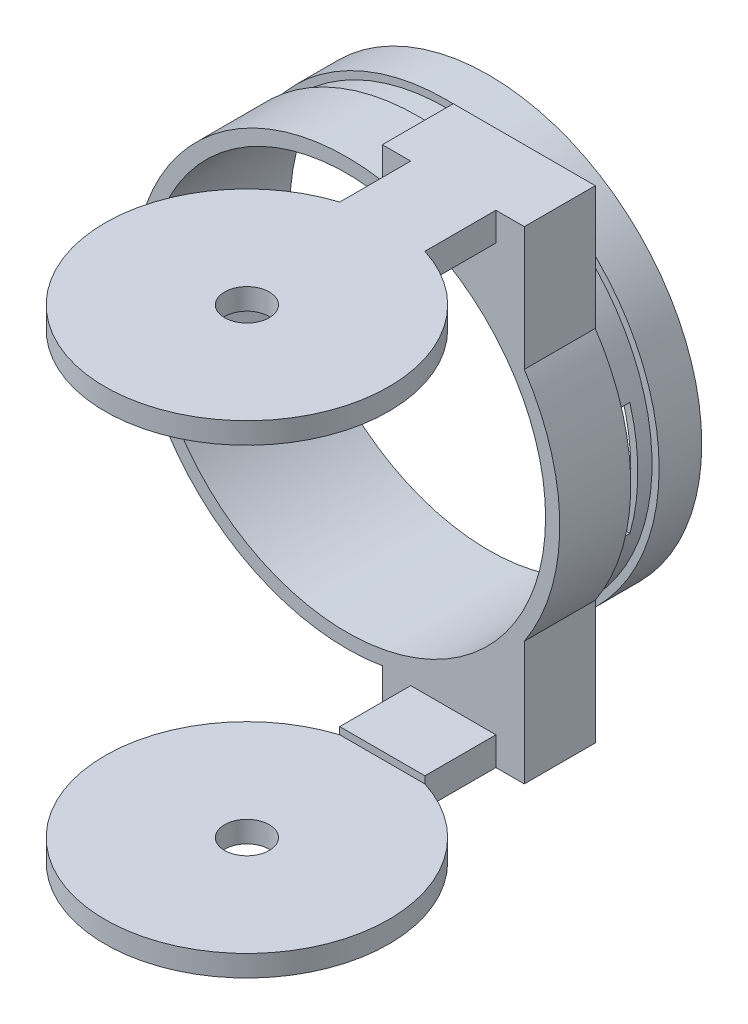
ISO-10303-21;
HEADER;
FILE_DESCRIPTION(('STEP AP214'),'2;1');
FILE_NAME('part.step','',(''),(''),'','','');
FILE_SCHEMA(('AUTOMOTIVE_DESIGN { 1 0 10303 214 1 1 1 1 }'));
ENDSEC;
DATA;
#1=APPLICATION_CONTEXT('core data for automotive mechanical design processes');
#2=APPLICATION_PROTOCOL_DEFINITION('international standard','automotive_design',2000,#1);
#3=PRODUCT_CONTEXT('',#1,'mechanical');
#4=PRODUCT('Part','Part','',(#3));
#5=PRODUCT_RELATED_PRODUCT_CATEGORY('part','',(#4));
#6=PRODUCT_DEFINITION_FORMATION('','',#4);
#7=PRODUCT_DEFINITION_CONTEXT('part definition',#1,'design');
#8=PRODUCT_DEFINITION('design','',#6,#7);
#9=PRODUCT_DEFINITION_SHAPE('','',#8);
#10=(LENGTH_UNIT() NAMED_UNIT(*) SI_UNIT(.MILLI.,.METRE.));
#11=(NAMED_UNIT(*) PLANE_ANGLE_UNIT() SI_UNIT($,.RADIAN.));
#12=(NAMED_UNIT(*) SI_UNIT($,.STERADIAN.) SOLID_ANGLE_UNIT());
#13=UNCERTAINTY_MEASURE_WITH_UNIT(LENGTH_MEASURE(1.E-05),#10,'distance_accuracy_value','');
#14=(GEOMETRIC_REPRESENTATION_CONTEXT(3) GLOBAL_UNCERTAINTY_ASSIGNED_CONTEXT((#13)) GLOBAL_UNIT_ASSIGNED_CONTEXT((#10,
#11,#12)) REPRESENTATION_CONTEXT('',''));
#15=CARTESIAN_POINT('',(0.,0.,0.));
#16=DIRECTION('',(0.,0.,1.));
#17=DIRECTION('',(1.,0.,0.));
#18=AXIS2_PLACEMENT_3D('',#15,#16,#17);
#19=CARTESIAN_POINT('',(0.,0.,12.7));
#20=DIRECTION('',(0.,0.,-1.));
#21=DIRECTION('',(-1.,0.,0.));
#22=AXIS2_PLACEMENT_3D('',#19,#20,#21);
#23=CYLINDRICAL_SURFACE('',#22,35.56);
#24=CARTESIAN_POINT('',(0.,0.,12.7));
#25=DIRECTION('',(0.,0.,1.));
#26=DIRECTION('',(1.,0.,0.));
#27=AXIS2_PLACEMENT_3D('',#24,#25,#26);
#28=CIRCLE('',#27,35.56);
#29=CARTESIAN_POINT('',(35.56,0.,12.7));
#30=VERTEX_POINT('',#29);
#31=EDGE_CURVE('E349',#30,#30,#28,.T.);
#32=ORIENTED_EDGE('',*,*,#31,.T.);
#33=EDGE_LOOP('',(#32));
#34=FACE_BOUND('',#33,.T.);
#35=CARTESIAN_POINT('',(0.,0.,-12.7));
#36=DIRECTION('',(0.,0.,-1.));
#37=DIRECTION('',(-1.,0.,0.));
#38=AXIS2_PLACEMENT_3D('',#35,#36,#37);
#39=CIRCLE('',#38,35.56);
#40=CARTESIAN_POINT('',(-35.56,0.,-12.7));
#41=VERTEX_POINT('',#40);
#42=EDGE_CURVE('E242',#41,#41,#39,.T.);
#43=ORIENTED_EDGE('',*,*,#42,.T.);
#44=EDGE_LOOP('',(#43));
#45=FACE_BOUND('',#44,.T.);
#46=DIRECTION('',(0.,0.,-1.));
#47=VECTOR('',#46,1.);
#48=CARTESIAN_POINT('',(34.0776759770968,10.16,12.7));
#49=LINE('',#48,#47);
#50=CARTESIAN_POINT('',(34.0776759770968,10.16,-2.54));
#51=VERTEX_POINT('',#50);
#52=CARTESIAN_POINT('',(34.0776759770968,10.16,0.));
#53=VERTEX_POINT('',#52);
#54=EDGE_CURVE('E229',#51,#53,#49,.F.);
#55=ORIENTED_EDGE('',*,*,#54,.T.);
#56=CARTESIAN_POINT('',(0.,0.,0.));
#57=DIRECTION('',(0.,0.,-1.));
#58=DIRECTION('',(0.,1.,0.));
#59=AXIS2_PLACEMENT_3D('',#56,#57,#58);
#60=CIRCLE('',#59,35.56);
#61=CARTESIAN_POINT('',(34.0776759770968,-10.16,0.));
#62=VERTEX_POINT('',#61);
#63=EDGE_CURVE('E199',#53,#62,#60,.T.);
#64=ORIENTED_EDGE('',*,*,#63,.T.);
#65=DIRECTION('',(0.,0.,-1.));
#66=VECTOR('',#65,1.);
#67=CARTESIAN_POINT('',(34.0776759770968,-10.16,12.7));
#68=LINE('',#67,#66);
#69=CARTESIAN_POINT('',(34.0776759770968,-10.16,-2.54));
#70=VERTEX_POINT('',#69);
#71=EDGE_CURVE('E237',#62,#70,#68,.T.);
#72=ORIENTED_EDGE('',*,*,#71,.T.);
#73=CARTESIAN_POINT('',(0.,0.,-2.54));
#74=DIRECTION('',(0.,0.,1.));
#75=DIRECTION('',(0.,-1.,0.));
#76=AXIS2_PLACEMENT_3D('',#73,#74,#75);
#77=CIRCLE('',#76,35.56);
#78=EDGE_CURVE('E221',#70,#51,#77,.T.);
#79=ORIENTED_EDGE('',*,*,#78,.T.);
#80=EDGE_LOOP('',(#55,#64,#72,#79));
#81=FACE_BOUND('',#80,.T.);
#82=ADVANCED_FACE('F38',(#34,#45,#81),#23,.F.);
#83=CARTESIAN_POINT('',(0.,0.,-5.08));
#84=DIRECTION('',(0.,0.,1.));
#85=DIRECTION('',(1.,0.,0.));
#86=AXIS2_PLACEMENT_3D('',#83,#84,#85);
#87=CYLINDRICAL_SURFACE('',#86,36.83);
#88=CARTESIAN_POINT('',(0.,0.,-5.08));
#89=DIRECTION('',(0.,0.,-1.));
#90=DIRECTION('',(-1.,0.,0.));
#91=AXIS2_PLACEMENT_3D('',#88,#89,#90);
#92=CIRCLE('',#91,36.83);
#93=CARTESIAN_POINT('',(-36.83,0.,-5.08));
#94=VERTEX_POINT('',#93);
#95=EDGE_CURVE('E251',#94,#94,#92,.T.);
#96=ORIENTED_EDGE('',*,*,#95,.F.);
#97=EDGE_LOOP('',(#96));
#98=FACE_BOUND('',#97,.T.);
#99=DIRECTION('',(0.,0.,1.));
#100=VECTOR('',#99,1.);
#101=CARTESIAN_POINT('',(35.4008940565066,-10.16,-5.08));
#102=LINE('',#101,#100);
#103=CARTESIAN_POINT('',(35.4008940565066,-10.16,0.));
#104=VERTEX_POINT('',#103);
#105=CARTESIAN_POINT('',(35.4008940565066,-10.16,-2.54));
#106=VERTEX_POINT('',#105);
#107=EDGE_CURVE('E11',#104,#106,#102,.F.);
#108=ORIENTED_EDGE('',*,*,#107,.F.);
#109=CARTESIAN_POINT('',(0.,0.,0.));
#110=DIRECTION('',(0.,0.,1.));
#111=DIRECTION('',(1.,0.,0.));
#112=AXIS2_PLACEMENT_3D('',#109,#110,#111);
#113=CIRCLE('',#112,36.83);
#114=CARTESIAN_POINT('',(35.4008940565066,10.16,0.));
#115=VERTEX_POINT('',#114);
#116=EDGE_CURVE('E191',#104,#115,#113,.F.);
#117=ORIENTED_EDGE('',*,*,#116,.T.);
#118=DIRECTION('',(0.,0.,1.));
#119=VECTOR('',#118,1.);
#120=CARTESIAN_POINT('',(35.4008940565066,10.16,-5.08000000000001));
#121=LINE('',#120,#119);
#122=CARTESIAN_POINT('',(35.4008940565066,10.16,-2.54));
#123=VERTEX_POINT('',#122);
#124=EDGE_CURVE('E185',#123,#115,#121,.T.);
#125=ORIENTED_EDGE('',*,*,#124,.F.);
#126=CARTESIAN_POINT('',(0.,0.,-2.54));
#127=DIRECTION('',(0.,0.,1.));
#128=DIRECTION('',(0.,-1.,0.));
#129=AXIS2_PLACEMENT_3D('',#126,#127,#128);
#130=CIRCLE('',#129,36.83);
#131=EDGE_CURVE('E48',#106,#123,#130,.T.);
#132=ORIENTED_EDGE('',*,*,#131,.F.);
#133=EDGE_LOOP('',(#108,#117,#125,#132));
#134=FACE_BOUND('',#133,.T.);
#135=ADVANCED_FACE('F205',(#98,#134),#87,.T.);
#136=CARTESIAN_POINT('',(0.,0.,0.));
#137=DIRECTION('',(0.,0.,1.));
#138=DIRECTION('',(1.,0.,0.));
#139=AXIS2_PLACEMENT_3D('',#136,#137,#138);
#140=PLANE('',#139);
#141=ORIENTED_EDGE('',*,*,#116,.F.);
#142=DIRECTION('',(-1.,0.,0.));
#143=VECTOR('',#142,1.);
#144=CARTESIAN_POINT('',(44.45,-10.16,0.));
#145=LINE('',#144,#143);
#146=EDGE_CURVE('E225',#104,#62,#145,.T.);
#147=ORIENTED_EDGE('',*,*,#146,.T.);
#148=ORIENTED_EDGE('',*,*,#63,.F.);
#149=DIRECTION('',(-1.,0.,0.));
#150=VECTOR('',#149,1.);
#151=CARTESIAN_POINT('',(44.45,10.16,0.));
#152=LINE('',#151,#150);
#153=EDGE_CURVE('E55',#115,#53,#152,.T.);
#154=ORIENTED_EDGE('',*,*,#153,.F.);
#155=EDGE_LOOP('',(#141,#147,#148,#154));
#156=FACE_BOUND('',#155,.T.);
#157=DIRECTION('',(0.,-1.,0.));
#158=VECTOR('',#157,1.);
#159=CARTESIAN_POINT('',(31.75,38.1,0.));
#160=LINE('',#159,#158);
#161=CARTESIAN_POINT('',(31.75,43.18,0.));
#162=VERTEX_POINT('',#161);
#163=CARTESIAN_POINT('',(31.75,21.0605674187568,0.));
#164=VERTEX_POINT('',#163);
#165=EDGE_CURVE('E380',#162,#164,#160,.T.);
#166=ORIENTED_EDGE('',*,*,#165,.T.);
#167=CARTESIAN_POINT('',(0.,0.,0.));
#168=DIRECTION('',(0.,0.,1.));
#169=DIRECTION('',(1.,0.,0.));
#170=AXIS2_PLACEMENT_3D('',#167,#168,#169);
#171=CIRCLE('',#170,38.1);
#172=CARTESIAN_POINT('',(31.75,-21.0605674187568,0.));
#173=VERTEX_POINT('',#172);
#174=EDGE_CURVE('E364',#173,#164,#171,.T.);
#175=ORIENTED_EDGE('',*,*,#174,.F.);
#176=DIRECTION('',(0.,-1.,0.));
#177=VECTOR('',#176,1.);
#178=CARTESIAN_POINT('',(31.75,43.181,0.));
#179=LINE('',#178,#177);
#180=CARTESIAN_POINT('',(31.75,-43.18,0.));
#181=VERTEX_POINT('',#180);
#182=EDGE_CURVE('E338',#173,#181,#179,.T.);
#183=ORIENTED_EDGE('',*,*,#182,.T.);
#184=DIRECTION('',(-1.,0.,0.));
#185=VECTOR('',#184,1.);
#186=CARTESIAN_POINT('',(31.75,-43.18,0.));
#187=LINE('',#186,#185);
#188=CARTESIAN_POINT('',(6.35,-43.18,0.));
#189=VERTEX_POINT('',#188);
#190=EDGE_CURVE('E316',#181,#189,#187,.T.);
#191=ORIENTED_EDGE('',*,*,#190,.T.);
#192=DIRECTION('',(0.,-1.,0.));
#193=VECTOR('',#192,1.);
#194=CARTESIAN_POINT('',(6.35000000000005,43.181,0.));
#195=LINE('',#194,#193);
#196=CARTESIAN_POINT('',(6.35,-37.5671066226826,0.));
#197=VERTEX_POINT('',#196);
#198=EDGE_CURVE('E332',#197,#189,#195,.T.);
#199=ORIENTED_EDGE('',*,*,#198,.F.);
#200=CARTESIAN_POINT('',(6.35,37.5671066226826,0.));
#201=VERTEX_POINT('',#200);
#202=EDGE_CURVE('E357',#201,#197,#171,.T.);
#203=ORIENTED_EDGE('',*,*,#202,.F.);
#204=DIRECTION('',(0.,1.,0.));
#205=VECTOR('',#204,1.);
#206=CARTESIAN_POINT('',(6.35,38.1,0.));
#207=LINE('',#206,#205);
#208=CARTESIAN_POINT('',(6.35,43.18,0.));
#209=VERTEX_POINT('',#208);
#210=EDGE_CURVE('E384',#201,#209,#207,.T.);
#211=ORIENTED_EDGE('',*,*,#210,.T.);
#212=DIRECTION('',(1.,0.,0.));
#213=VECTOR('',#212,1.);
#214=CARTESIAN_POINT('',(31.75,43.18,0.));
#215=LINE('',#214,#213);
#216=EDGE_CURVE('E388',#209,#162,#215,.T.);
#217=ORIENTED_EDGE('',*,*,#216,.T.);
#218=EDGE_LOOP('',(#166,#175,#183,#191,#199,#203,#211,#217));
#219=FACE_BOUND('',#218,.T.);
#220=ADVANCED_FACE('F195',(#156,#219),#140,.F.);
#221=CARTESIAN_POINT('',(0.,0.,25.4));
#222=DIRECTION('',(0.,0.,1.));
#223=DIRECTION('',(1.,0.,0.));
#224=AXIS2_PLACEMENT_3D('',#221,#222,#223);
#225=PLANE('',#224);
#226=DIRECTION('',(0.,-1.,0.));
#227=VECTOR('',#226,1.);
#228=CARTESIAN_POINT('',(11.43,-43.18,25.4));
#229=LINE('',#228,#227);
#230=CARTESIAN_POINT('',(11.43,-38.1,25.4));
#231=VERTEX_POINT('',#230);
#232=CARTESIAN_POINT('',(11.43,-39.37,25.4));
#233=VERTEX_POINT('',#232);
#234=EDGE_CURVE('E284',#231,#233,#229,.T.);
#235=ORIENTED_EDGE('',*,*,#234,.T.);
#236=DIRECTION('',(1.,0.,0.));
#237=VECTOR('',#236,1.);
#238=CARTESIAN_POINT('',(0.,-39.37,25.4));
#239=LINE('',#238,#237);
#240=CARTESIAN_POINT('',(26.67,-39.37,25.4));
#241=VERTEX_POINT('',#240);
#242=EDGE_CURVE('E207',#233,#241,#239,.T.);
#243=ORIENTED_EDGE('',*,*,#242,.T.);
#244=DIRECTION('',(0.,1.,0.));
#245=VECTOR('',#244,1.);
#246=CARTESIAN_POINT('',(26.67,-43.18,25.4));
#247=LINE('',#246,#245);
#248=CARTESIAN_POINT('',(26.67,-38.1,25.4));
#249=VERTEX_POINT('',#248);
#250=EDGE_CURVE('E280',#241,#249,#247,.T.);
#251=ORIENTED_EDGE('',*,*,#250,.T.);
#252=DIRECTION('',(-1.,0.,0.));
#253=VECTOR('',#252,1.);
#254=CARTESIAN_POINT('',(11.43,-38.1,25.4));
#255=LINE('',#254,#253);
#256=EDGE_CURVE('E279',#249,#231,#255,.T.);
#257=ORIENTED_EDGE('',*,*,#256,.T.);
#258=EDGE_LOOP('',(#235,#243,#251,#257));
#259=FACE_BOUND('',#258,.T.);
#260=ADVANCED_FACE('F498',(#259),#225,.T.);
#261=CARTESIAN_POINT('',(0.,0.,25.4));
#262=DIRECTION('',(0.,0.,1.));
#263=DIRECTION('',(1.,0.,0.));
#264=AXIS2_PLACEMENT_3D('',#261,#262,#263);
#265=PLANE('',#264);
#266=DIRECTION('',(0.,1.,0.));
#267=VECTOR('',#266,1.);
#268=CARTESIAN_POINT('',(26.67,43.18,25.4));
#269=LINE('',#268,#267);
#270=CARTESIAN_POINT('',(26.67,38.1,25.4));
#271=VERTEX_POINT('',#270);
#272=CARTESIAN_POINT('',(26.67,39.37,25.4));
#273=VERTEX_POINT('',#272);
#274=EDGE_CURVE('E409',#271,#273,#269,.T.);
#275=ORIENTED_EDGE('',*,*,#274,.T.);
#276=DIRECTION('',(-1.,0.,0.));
#277=VECTOR('',#276,1.);
#278=CARTESIAN_POINT('',(0.,39.37,25.4));
#279=LINE('',#278,#277);
#280=CARTESIAN_POINT('',(11.43,39.37,25.4));
#281=VERTEX_POINT('',#280);
#282=EDGE_CURVE('E210',#273,#281,#279,.T.);
#283=ORIENTED_EDGE('',*,*,#282,.T.);
#284=DIRECTION('',(0.,-1.,0.));
#285=VECTOR('',#284,1.);
#286=CARTESIAN_POINT('',(11.43,43.18,25.4));
#287=LINE('',#286,#285);
#288=CARTESIAN_POINT('',(11.43,38.1,25.4));
#289=VERTEX_POINT('',#288);
#290=EDGE_CURVE('E413',#281,#289,#287,.T.);
#291=ORIENTED_EDGE('',*,*,#290,.T.);
#292=DIRECTION('',(1.,0.,0.));
#293=VECTOR('',#292,1.);
#294=CARTESIAN_POINT('',(11.43,38.1,25.4));
#295=LINE('',#294,#293);
#296=EDGE_CURVE('E419',#289,#271,#295,.T.);
#297=ORIENTED_EDGE('',*,*,#296,.T.);
#298=EDGE_LOOP('',(#275,#283,#291,#297));
#299=FACE_BOUND('',#298,.T.);
#300=ADVANCED_FACE('F446',(#299),#265,.T.);
#301=CARTESIAN_POINT('',(11.43,38.1,25.4));
#302=DIRECTION('',(0.,1.,0.));
#303=DIRECTION('',(0.,0.,1.));
#304=AXIS2_PLACEMENT_3D('',#301,#302,#303);
#305=PLANE('',#304);
#306=DIRECTION('',(-1.,0.,0.));
#307=VECTOR('',#306,1.);
#308=CARTESIAN_POINT('',(31.75,38.1,12.7));
#309=LINE('',#308,#307);
#310=CARTESIAN_POINT('',(26.67,38.1,12.7));
#311=VERTEX_POINT('',#310);
#312=CARTESIAN_POINT('',(11.43,38.1,12.7));
#313=VERTEX_POINT('',#312);
#314=EDGE_CURVE('E367',#311,#313,#309,.T.);
#315=ORIENTED_EDGE('',*,*,#314,.F.);
#316=DIRECTION('',(0.,0.,-1.));
#317=VECTOR('',#316,1.);
#318=CARTESIAN_POINT('',(26.67,38.1,25.4));
#319=LINE('',#318,#317);
#320=EDGE_CURVE('E422',#271,#311,#319,.T.);
#321=ORIENTED_EDGE('',*,*,#320,.F.);
#322=ORIENTED_EDGE('',*,*,#296,.F.);
#323=DIRECTION('',(0.,0.,-1.));
#324=VECTOR('',#323,1.);
#325=CARTESIAN_POINT('',(11.43,38.1,25.4));
#326=LINE('',#325,#324);
#327=EDGE_CURVE('E432',#289,#313,#326,.T.);
#328=ORIENTED_EDGE('',*,*,#327,.T.);
#329=EDGE_LOOP('',(#315,#321,#322,#328));
#330=FACE_BOUND('',#329,.T.);
#331=ADVANCED_FACE('F512',(#330),#305,.F.);
#332=CARTESIAN_POINT('',(26.67,43.18,25.4));
#333=DIRECTION('',(-1.,0.,0.));
#334=DIRECTION('',(0.,-1.,0.));
#335=AXIS2_PLACEMENT_3D('',#332,#333,#334);
#336=PLANE('',#335);
#337=DIRECTION('',(0.,1.,0.));
#338=VECTOR('',#337,1.);
#339=CARTESIAN_POINT('',(26.67,43.18,12.7));
#340=LINE('',#339,#338);
#341=CARTESIAN_POINT('',(26.67,43.18,12.7));
#342=VERTEX_POINT('',#341);
#343=EDGE_CURVE('E408',#311,#342,#340,.T.);
#344=ORIENTED_EDGE('',*,*,#343,.T.);
#345=DIRECTION('',(0.,0.,-1.));
#346=VECTOR('',#345,1.);
#347=CARTESIAN_POINT('',(26.67,43.18,25.4));
#348=LINE('',#347,#346);
#349=CARTESIAN_POINT('',(26.67,43.18,25.4));
#350=VERTEX_POINT('',#349);
#351=EDGE_CURVE('E371',#350,#342,#348,.T.);
#352=ORIENTED_EDGE('',*,*,#351,.F.);
#353=EDGE_CURVE('E414',#273,#350,#269,.T.);
#354=ORIENTED_EDGE('',*,*,#353,.F.);
#355=ORIENTED_EDGE('',*,*,#274,.F.);
#356=ORIENTED_EDGE('',*,*,#320,.T.);
#357=EDGE_LOOP('',(#344,#352,#354,#355,#356));
#358=FACE_BOUND('',#357,.T.);
#359=ADVANCED_FACE('F40',(#358),#336,.F.);
#360=CARTESIAN_POINT('',(11.43,43.18,25.4));
#361=DIRECTION('',(0.,-1.,0.));
#362=DIRECTION('',(0.,0.,-1.));
#363=AXIS2_PLACEMENT_3D('',#360,#361,#362);
#364=PLANE('',#363);
#365=CARTESIAN_POINT('',(19.05,43.18,49.6300557159904));
#366=DIRECTION('',(0.,-1.,0.));
#367=DIRECTION('',(0.,0.,-1.));
#368=AXIS2_PLACEMENT_3D('',#365,#366,#367);
#369=CIRCLE('',#368,4.);
#370=CARTESIAN_POINT('',(19.05,43.18,45.6300557159904));
#371=VERTEX_POINT('',#370);
#372=EDGE_CURVE('E202',#371,#371,#369,.T.);
#373=ORIENTED_EDGE('',*,*,#372,.T.);
#374=EDGE_LOOP('',(#373));
#375=FACE_BOUND('',#374,.T.);
#376=DIRECTION('',(0.,0.,-1.));
#377=VECTOR('',#376,1.);
#378=CARTESIAN_POINT('',(11.43,43.18,25.4));
#379=LINE('',#378,#377);
#380=CARTESIAN_POINT('',(11.43,43.18,25.4));
#381=VERTEX_POINT('',#380);
#382=CARTESIAN_POINT('',(11.43,43.18,12.7));
#383=VERTEX_POINT('',#382);
#384=EDGE_CURVE('E436',#381,#383,#379,.T.);
#385=ORIENTED_EDGE('',*,*,#384,.F.);
#386=CARTESIAN_POINT('',(19.05,43.18,49.6300557159904));
#387=DIRECTION('',(0.,1.,0.));
#388=DIRECTION('',(0.,0.,1.));
#389=AXIS2_PLACEMENT_3D('',#386,#387,#388);
#390=CIRCLE('',#389,25.4);
#391=EDGE_CURVE('E263',#381,#350,#390,.T.);
#392=ORIENTED_EDGE('',*,*,#391,.T.);
#393=ORIENTED_EDGE('',*,*,#351,.T.);
#394=DIRECTION('',(1.,0.,0.));
#395=VECTOR('',#394,1.);
#396=CARTESIAN_POINT('',(31.75,43.18,12.7));
#397=LINE('',#396,#395);
#398=CARTESIAN_POINT('',(31.75,43.18,12.7));
#399=VERTEX_POINT('',#398);
#400=EDGE_CURVE('E397',#342,#399,#397,.T.);
#401=ORIENTED_EDGE('',*,*,#400,.T.);
#402=DIRECTION('',(0.,0.,1.));
#403=VECTOR('',#402,1.);
#404=CARTESIAN_POINT('',(31.75,43.18,0.));
#405=LINE('',#404,#403);
#406=EDGE_CURVE('E391',#162,#399,#405,.T.);
#407=ORIENTED_EDGE('',*,*,#406,.F.);
#408=ORIENTED_EDGE('',*,*,#216,.F.);
#409=DIRECTION('',(0.,0.,1.));
#410=VECTOR('',#409,1.);
#411=CARTESIAN_POINT('',(6.35,43.18,0.));
#412=LINE('',#411,#410);
#413=CARTESIAN_POINT('',(6.35,43.18,12.7));
#414=VERTEX_POINT('',#413);
#415=EDGE_CURVE('E404',#209,#414,#412,.T.);
#416=ORIENTED_EDGE('',*,*,#415,.T.);
#417=EDGE_CURVE('E385',#414,#383,#397,.T.);
#418=ORIENTED_EDGE('',*,*,#417,.T.);
#419=EDGE_LOOP('',(#385,#392,#393,#401,#407,#408,#416,#418));
#420=FACE_BOUND('',#419,.T.);
#421=ADVANCED_FACE('F517',(#375,#420),#364,.F.);
#422=CARTESIAN_POINT('',(11.43,43.18,25.4));
#423=DIRECTION('',(1.,0.,0.));
#424=DIRECTION('',(0.,1.,0.));
#425=AXIS2_PLACEMENT_3D('',#422,#423,#424);
#426=PLANE('',#425);
#427=DIRECTION('',(0.,-1.,0.));
#428=VECTOR('',#427,1.);
#429=CARTESIAN_POINT('',(11.43,43.18,12.7));
#430=LINE('',#429,#428);
#431=EDGE_CURVE('E426',#383,#313,#430,.T.);
#432=ORIENTED_EDGE('',*,*,#431,.T.);
#433=ORIENTED_EDGE('',*,*,#327,.F.);
#434=ORIENTED_EDGE('',*,*,#290,.F.);
#435=EDGE_CURVE('E415',#381,#281,#287,.T.);
#436=ORIENTED_EDGE('',*,*,#435,.F.);
#437=ORIENTED_EDGE('',*,*,#384,.T.);
#438=EDGE_LOOP('',(#432,#433,#434,#436,#437));
#439=FACE_BOUND('',#438,.T.);
#440=ADVANCED_FACE('F452',(#439),#426,.F.);
#441=CARTESIAN_POINT('',(0.,0.,12.7));
#442=DIRECTION('',(0.,0.,1.));
#443=DIRECTION('',(1.,0.,0.));
#444=AXIS2_PLACEMENT_3D('',#441,#442,#443);
#445=PLANE('',#444);
#446=ORIENTED_EDGE('',*,*,#343,.F.);
#447=ORIENTED_EDGE('',*,*,#314,.T.);
#448=ORIENTED_EDGE('',*,*,#431,.F.);
#449=ORIENTED_EDGE('',*,*,#417,.F.);
#450=DIRECTION('',(0.,1.,0.));
#451=VECTOR('',#450,1.);
#452=CARTESIAN_POINT('',(6.35,38.1,12.7));
#453=LINE('',#452,#451);
#454=CARTESIAN_POINT('',(6.35,37.5671066226826,12.7));
#455=VERTEX_POINT('',#454);
#456=EDGE_CURVE('E394',#455,#414,#453,.T.);
#457=ORIENTED_EDGE('',*,*,#456,.F.);
#458=CARTESIAN_POINT('',(0.,0.,12.7));
#459=DIRECTION('',(0.,0.,1.));
#460=DIRECTION('',(1.,0.,0.));
#461=AXIS2_PLACEMENT_3D('',#458,#459,#460);
#462=CIRCLE('',#461,38.1);
#463=CARTESIAN_POINT('',(6.35,-37.5671066226826,12.7));
#464=VERTEX_POINT('',#463);
#465=EDGE_CURVE('E363',#455,#464,#462,.T.);
#466=ORIENTED_EDGE('',*,*,#465,.T.);
#467=DIRECTION('',(0.,-1.,0.));
#468=VECTOR('',#467,1.);
#469=CARTESIAN_POINT('',(6.35000000000005,43.181,12.7));
#470=LINE('',#469,#468);
#471=CARTESIAN_POINT('',(6.35,-43.18,12.7));
#472=VERTEX_POINT('',#471);
#473=EDGE_CURVE('E341',#464,#472,#470,.T.);
#474=ORIENTED_EDGE('',*,*,#473,.T.);
#475=DIRECTION('',(-1.,0.,0.));
#476=VECTOR('',#475,1.);
#477=CARTESIAN_POINT('',(31.75,-43.18,12.7));
#478=LINE('',#477,#476);
#479=CARTESIAN_POINT('',(11.43,-43.18,12.7));
#480=VERTEX_POINT('',#479);
#481=EDGE_CURVE('E315',#480,#472,#478,.T.);
#482=ORIENTED_EDGE('',*,*,#481,.F.);
#483=DIRECTION('',(0.,-1.,0.));
#484=VECTOR('',#483,1.);
#485=CARTESIAN_POINT('',(11.43,-43.18,12.7));
#486=LINE('',#485,#484);
#487=CARTESIAN_POINT('',(11.43,-38.1,12.7));
#488=VERTEX_POINT('',#487);
#489=EDGE_CURVE('E296',#488,#480,#486,.T.);
#490=ORIENTED_EDGE('',*,*,#489,.F.);
#491=DIRECTION('',(-1.,0.,0.));
#492=VECTOR('',#491,1.);
#493=CARTESIAN_POINT('',(11.43,-38.1,12.7));
#494=LINE('',#493,#492);
#495=CARTESIAN_POINT('',(26.67,-38.1,12.7));
#496=VERTEX_POINT('',#495);
#497=EDGE_CURVE('E292',#496,#488,#494,.T.);
#498=ORIENTED_EDGE('',*,*,#497,.F.);
#499=DIRECTION('',(0.,1.,0.));
#500=VECTOR('',#499,1.);
#501=CARTESIAN_POINT('',(26.67,-43.18,12.7));
#502=LINE('',#501,#500);
#503=CARTESIAN_POINT('',(26.67,-43.18,12.7));
#504=VERTEX_POINT('',#503);
#505=EDGE_CURVE('E271',#504,#496,#502,.T.);
#506=ORIENTED_EDGE('',*,*,#505,.F.);
#507=CARTESIAN_POINT('',(31.75,-43.18,12.7));
#508=VERTEX_POINT('',#507);
#509=EDGE_CURVE('E321',#508,#504,#478,.T.);
#510=ORIENTED_EDGE('',*,*,#509,.F.);
#511=DIRECTION('',(0.,-1.,0.));
#512=VECTOR('',#511,1.);
#513=CARTESIAN_POINT('',(31.75,43.181,12.7));
#514=LINE('',#513,#512);
#515=CARTESIAN_POINT('',(31.75,-21.0605674187568,12.7));
#516=VERTEX_POINT('',#515);
#517=EDGE_CURVE('E345',#516,#508,#514,.T.);
#518=ORIENTED_EDGE('',*,*,#517,.F.);
#519=CARTESIAN_POINT('',(31.75,21.0605674187568,12.7));
#520=VERTEX_POINT('',#519);
#521=EDGE_CURVE('E358',#516,#520,#462,.T.);
#522=ORIENTED_EDGE('',*,*,#521,.T.);
#523=DIRECTION('',(0.,-1.,0.));
#524=VECTOR('',#523,1.);
#525=CARTESIAN_POINT('',(31.75,38.1,12.7));
#526=LINE('',#525,#524);
#527=EDGE_CURVE('E379',#399,#520,#526,.T.);
#528=ORIENTED_EDGE('',*,*,#527,.F.);
#529=ORIENTED_EDGE('',*,*,#400,.F.);
#530=EDGE_LOOP('',(#446,#447,#448,#449,#457,#466,#474,#482,#490,#498,#506,#510,#518,#522,#528,#529));
#531=FACE_BOUND('',#530,.T.);
#532=ORIENTED_EDGE('',*,*,#31,.F.);
#533=EDGE_LOOP('',(#532));
#534=FACE_BOUND('',#533,.T.);
#535=ADVANCED_FACE('F499',(#531,#534),#445,.T.);
#536=CARTESIAN_POINT('',(31.75,38.1,0.));
#537=DIRECTION('',(-1.,0.,0.));
#538=DIRECTION('',(0.,0.,1.));
#539=AXIS2_PLACEMENT_3D('',#536,#537,#538);
#540=PLANE('',#539);
#541=ORIENTED_EDGE('',*,*,#527,.T.);
#542=DIRECTION('',(0.,0.,-1.));
#543=VECTOR('',#542,1.);
#544=CARTESIAN_POINT('',(31.75,21.0605674187568,12.7));
#545=LINE('',#544,#543);
#546=EDGE_CURVE('E362',#164,#520,#545,.F.);
#547=ORIENTED_EDGE('',*,*,#546,.F.);
#548=ORIENTED_EDGE('',*,*,#165,.F.);
#549=ORIENTED_EDGE('',*,*,#406,.T.);
#550=EDGE_LOOP('',(#541,#547,#548,#549));
#551=FACE_BOUND('',#550,.T.);
#552=ADVANCED_FACE('F502',(#551),#540,.F.);
#553=CARTESIAN_POINT('',(6.35,38.1,0.));
#554=DIRECTION('',(1.,0.,0.));
#555=DIRECTION('',(0.,1.,0.));
#556=AXIS2_PLACEMENT_3D('',#553,#554,#555);
#557=PLANE('',#556);
#558=ORIENTED_EDGE('',*,*,#456,.T.);
#559=ORIENTED_EDGE('',*,*,#415,.F.);
#560=ORIENTED_EDGE('',*,*,#210,.F.);
#561=DIRECTION('',(0.,0.,-1.));
#562=VECTOR('',#561,1.);
#563=CARTESIAN_POINT('',(6.35,37.5671066226826,12.7));
#564=LINE('',#563,#562);
#565=EDGE_CURVE('E375',#455,#201,#564,.T.);
#566=ORIENTED_EDGE('',*,*,#565,.F.);
#567=EDGE_LOOP('',(#558,#559,#560,#566));
#568=FACE_BOUND('',#567,.T.);
#569=ADVANCED_FACE('F494',(#568),#557,.F.);
#570=CARTESIAN_POINT('',(0.,0.,12.7));
#571=DIRECTION('',(0.,0.,-1.));
#572=DIRECTION('',(-1.,0.,0.));
#573=AXIS2_PLACEMENT_3D('',#570,#571,#572);
#574=CYLINDRICAL_SURFACE('',#573,38.1);
#575=ORIENTED_EDGE('',*,*,#174,.T.);
#576=ORIENTED_EDGE('',*,*,#546,.T.);
#577=ORIENTED_EDGE('',*,*,#521,.F.);
#578=DIRECTION('',(0.,0.,-1.));
#579=VECTOR('',#578,1.);
#580=CARTESIAN_POINT('',(31.75,-21.0605674187568,12.7));
#581=LINE('',#580,#579);
#582=EDGE_CURVE('E337',#516,#173,#581,.T.);
#583=ORIENTED_EDGE('',*,*,#582,.T.);
#584=EDGE_LOOP('',(#575,#576,#577,#583));
#585=FACE_BOUND('',#584,.T.);
#586=ADVANCED_FACE('F490',(#585),#574,.T.);
#587=ORIENTED_EDGE('',*,*,#465,.F.);
#588=ORIENTED_EDGE('',*,*,#565,.T.);
#589=ORIENTED_EDGE('',*,*,#202,.T.);
#590=DIRECTION('',(0.,0.,-1.));
#591=VECTOR('',#590,1.);
#592=CARTESIAN_POINT('',(6.35,-37.5671066226826,12.7));
#593=LINE('',#592,#591);
#594=EDGE_CURVE('E333',#197,#464,#593,.F.);
#595=ORIENTED_EDGE('',*,*,#594,.T.);
#596=EDGE_LOOP('',(#587,#588,#589,#595));
#597=FACE_BOUND('',#596,.T.);
#598=ADVANCED_FACE('F493',(#597),#574,.T.);
#599=CARTESIAN_POINT('',(6.35000000000005,43.181,0.));
#600=DIRECTION('',(1.,0.,0.));
#601=DIRECTION('',(0.,1.,0.));
#602=AXIS2_PLACEMENT_3D('',#599,#600,#601);
#603=PLANE('',#602);
#604=ORIENTED_EDGE('',*,*,#594,.F.);
#605=ORIENTED_EDGE('',*,*,#198,.T.);
#606=DIRECTION('',(0.,0.,1.));
#607=VECTOR('',#606,1.);
#608=CARTESIAN_POINT('',(6.35,-43.18,0.));
#609=LINE('',#608,#607);
#610=EDGE_CURVE('E320',#189,#472,#609,.T.);
#611=ORIENTED_EDGE('',*,*,#610,.T.);
#612=ORIENTED_EDGE('',*,*,#473,.F.);
#613=EDGE_LOOP('',(#604,#605,#611,#612));
#614=FACE_BOUND('',#613,.T.);
#615=ADVANCED_FACE('F488',(#614),#603,.F.);
#616=CARTESIAN_POINT('',(31.75,43.181,12.7));
#617=DIRECTION('',(-1.,0.,0.));
#618=DIRECTION('',(0.,-1.,0.));
#619=AXIS2_PLACEMENT_3D('',#616,#617,#618);
#620=PLANE('',#619);
#621=ORIENTED_EDGE('',*,*,#582,.F.);
#622=ORIENTED_EDGE('',*,*,#517,.T.);
#623=DIRECTION('',(0.,0.,1.));
#624=VECTOR('',#623,1.);
#625=CARTESIAN_POINT('',(31.75,-43.18,0.));
#626=LINE('',#625,#624);
#627=EDGE_CURVE('E328',#181,#508,#626,.T.);
#628=ORIENTED_EDGE('',*,*,#627,.F.);
#629=ORIENTED_EDGE('',*,*,#182,.F.);
#630=EDGE_LOOP('',(#621,#622,#628,#629));
#631=FACE_BOUND('',#630,.T.);
#632=ADVANCED_FACE('F573',(#631),#620,.F.);
#633=CARTESIAN_POINT('',(31.75,-43.18,0.));
#634=DIRECTION('',(0.,1.,0.));
#635=DIRECTION('',(0.,0.,1.));
#636=AXIS2_PLACEMENT_3D('',#633,#634,#635);
#637=PLANE('',#636);
#638=CARTESIAN_POINT('',(19.05,-43.18,49.6300557159904));
#639=DIRECTION('',(0.,1.,0.));
#640=DIRECTION('',(0.,0.,1.));
#641=AXIS2_PLACEMENT_3D('',#638,#639,#640);
#642=CIRCLE('',#641,4.);
#643=CARTESIAN_POINT('',(19.05,-43.18,53.6300557159904));
#644=VERTEX_POINT('',#643);
#645=EDGE_CURVE('E720',#644,#644,#642,.T.);
#646=ORIENTED_EDGE('',*,*,#645,.T.);
#647=EDGE_LOOP('',(#646));
#648=FACE_BOUND('',#647,.T.);
#649=DIRECTION('',(0.,0.,-1.));
#650=VECTOR('',#649,1.);
#651=CARTESIAN_POINT('',(26.67,-43.18,25.4));
#652=LINE('',#651,#650);
#653=CARTESIAN_POINT('',(26.67,-43.18,25.4));
#654=VERTEX_POINT('',#653);
#655=EDGE_CURVE('E311',#654,#504,#652,.T.);
#656=ORIENTED_EDGE('',*,*,#655,.F.);
#657=CARTESIAN_POINT('',(19.05,-43.18,49.6300557159904));
#658=DIRECTION('',(0.,1.,0.));
#659=DIRECTION('',(0.,0.,1.));
#660=AXIS2_PLACEMENT_3D('',#657,#658,#659);
#661=CIRCLE('',#660,25.4);
#662=CARTESIAN_POINT('',(11.43,-43.18,25.4));
#663=VERTEX_POINT('',#662);
#664=EDGE_CURVE('E258',#663,#654,#661,.T.);
#665=ORIENTED_EDGE('',*,*,#664,.F.);
#666=DIRECTION('',(0.,0.,-1.));
#667=VECTOR('',#666,1.);
#668=CARTESIAN_POINT('',(11.43,-43.18,25.4));
#669=LINE('',#668,#667);
#670=EDGE_CURVE('E288',#663,#480,#669,.T.);
#671=ORIENTED_EDGE('',*,*,#670,.T.);
#672=ORIENTED_EDGE('',*,*,#481,.T.);
#673=ORIENTED_EDGE('',*,*,#610,.F.);
#674=ORIENTED_EDGE('',*,*,#190,.F.);
#675=ORIENTED_EDGE('',*,*,#627,.T.);
#676=ORIENTED_EDGE('',*,*,#509,.T.);
#677=EDGE_LOOP('',(#656,#665,#671,#672,#673,#674,#675,#676));
#678=FACE_BOUND('',#677,.T.);
#679=ADVANCED_FACE('F558',(#648,#678),#637,.F.);
#680=CARTESIAN_POINT('',(26.67,-43.18,25.4));
#681=DIRECTION('',(-1.,0.,0.));
#682=DIRECTION('',(0.,-1.,0.));
#683=AXIS2_PLACEMENT_3D('',#680,#681,#682);
#684=PLANE('',#683);
#685=ORIENTED_EDGE('',*,*,#505,.T.);
#686=DIRECTION('',(0.,0.,-1.));
#687=VECTOR('',#686,1.);
#688=CARTESIAN_POINT('',(26.67,-38.1,25.4));
#689=LINE('',#688,#687);
#690=EDGE_CURVE('E307',#249,#496,#689,.T.);
#691=ORIENTED_EDGE('',*,*,#690,.F.);
#692=ORIENTED_EDGE('',*,*,#250,.F.);
#693=EDGE_CURVE('E275',#654,#241,#247,.T.);
#694=ORIENTED_EDGE('',*,*,#693,.F.);
#695=ORIENTED_EDGE('',*,*,#655,.T.);
#696=EDGE_LOOP('',(#685,#691,#692,#694,#695));
#697=FACE_BOUND('',#696,.T.);
#698=ADVANCED_FACE('F549',(#697),#684,.F.);
#699=CARTESIAN_POINT('',(11.43,-38.1,25.4));
#700=DIRECTION('',(0.,-1.,0.));
#701=DIRECTION('',(0.,0.,-1.));
#702=AXIS2_PLACEMENT_3D('',#699,#700,#701);
#703=PLANE('',#702);
#704=ORIENTED_EDGE('',*,*,#497,.T.);
#705=DIRECTION('',(0.,0.,-1.));
#706=VECTOR('',#705,1.);
#707=CARTESIAN_POINT('',(11.43,-38.1,25.4));
#708=LINE('',#707,#706);
#709=EDGE_CURVE('E303',#231,#488,#708,.T.);
#710=ORIENTED_EDGE('',*,*,#709,.F.);
#711=ORIENTED_EDGE('',*,*,#256,.F.);
#712=ORIENTED_EDGE('',*,*,#690,.T.);
#713=EDGE_LOOP('',(#704,#710,#711,#712));
#714=FACE_BOUND('',#713,.T.);
#715=ADVANCED_FACE('F551',(#714),#703,.F.);
#716=CARTESIAN_POINT('',(11.43,-43.18,25.4));
#717=DIRECTION('',(1.,0.,0.));
#718=DIRECTION('',(0.,1.,0.));
#719=AXIS2_PLACEMENT_3D('',#716,#717,#718);
#720=PLANE('',#719);
#721=ORIENTED_EDGE('',*,*,#489,.T.);
#722=ORIENTED_EDGE('',*,*,#670,.F.);
#723=EDGE_CURVE('E283',#233,#663,#229,.T.);
#724=ORIENTED_EDGE('',*,*,#723,.F.);
#725=ORIENTED_EDGE('',*,*,#234,.F.);
#726=ORIENTED_EDGE('',*,*,#709,.T.);
#727=EDGE_LOOP('',(#721,#722,#724,#725,#726));
#728=FACE_BOUND('',#727,.T.);
#729=ADVANCED_FACE('F474',(#728),#720,.F.);
#730=CARTESIAN_POINT('',(19.05,39.37,49.6300557159904));
#731=DIRECTION('',(0.,1.,0.));
#732=DIRECTION('',(0.,0.,1.));
#733=AXIS2_PLACEMENT_3D('',#730,#731,#732);
#734=CYLINDRICAL_SURFACE('',#733,25.4);
#735=CARTESIAN_POINT('',(19.05,39.37,49.6300557159904));
#736=DIRECTION('',(0.,1.,0.));
#737=DIRECTION('',(0.,0.,1.));
#738=AXIS2_PLACEMENT_3D('',#735,#736,#737);
#739=CIRCLE('',#738,25.4);
#740=EDGE_CURVE('E267',#281,#273,#739,.T.);
#741=ORIENTED_EDGE('',*,*,#740,.T.);
#742=ORIENTED_EDGE('',*,*,#353,.T.);
#743=ORIENTED_EDGE('',*,*,#391,.F.);
#744=ORIENTED_EDGE('',*,*,#435,.T.);
#745=EDGE_LOOP('',(#741,#742,#743,#744));
#746=FACE_BOUND('',#745,.T.);
#747=ADVANCED_FACE('F458',(#746),#734,.T.);
#748=CARTESIAN_POINT('',(19.05,39.37,49.6300557159904));
#749=DIRECTION('',(0.,1.,0.));
#750=DIRECTION('',(0.,0.,1.));
#751=AXIS2_PLACEMENT_3D('',#748,#749,#750);
#752=PLANE('',#751);
#753=CARTESIAN_POINT('',(19.05,39.37,49.6300557159904));
#754=DIRECTION('',(0.,1.,0.));
#755=DIRECTION('',(0.,0.,1.));
#756=AXIS2_PLACEMENT_3D('',#753,#754,#755);
#757=CIRCLE('',#756,4.);
#758=CARTESIAN_POINT('',(19.05,39.37,53.6300557159904));
#759=VERTEX_POINT('',#758);
#760=EDGE_CURVE('E719',#759,#759,#757,.T.);
#761=ORIENTED_EDGE('',*,*,#760,.T.);
#762=EDGE_LOOP('',(#761));
#763=FACE_BOUND('',#762,.T.);
#764=ORIENTED_EDGE('',*,*,#282,.F.);
#765=ORIENTED_EDGE('',*,*,#740,.F.);
#766=EDGE_LOOP('',(#764,#765));
#767=FACE_BOUND('',#766,.T.);
#768=ADVANCED_FACE('F460',(#763,#767),#752,.F.);
#769=CARTESIAN_POINT('',(19.05,-39.37,49.6300557159904));
#770=DIRECTION('',(0.,-1.,0.));
#771=DIRECTION('',(0.,0.,-1.));
#772=AXIS2_PLACEMENT_3D('',#769,#770,#771);
#773=CYLINDRICAL_SURFACE('',#772,25.4);
#774=ORIENTED_EDGE('',*,*,#723,.T.);
#775=ORIENTED_EDGE('',*,*,#664,.T.);
#776=ORIENTED_EDGE('',*,*,#693,.T.);
#777=CARTESIAN_POINT('',(19.05,-39.37,49.6300557159904));
#778=DIRECTION('',(0.,1.,0.));
#779=DIRECTION('',(0.,0.,1.));
#780=AXIS2_PLACEMENT_3D('',#777,#778,#779);
#781=CIRCLE('',#780,25.4);
#782=EDGE_CURVE('E259',#233,#241,#781,.T.);
#783=ORIENTED_EDGE('',*,*,#782,.F.);
#784=EDGE_LOOP('',(#774,#775,#776,#783));
#785=FACE_BOUND('',#784,.T.);
#786=ADVANCED_FACE('F462',(#785),#773,.T.);
#787=CARTESIAN_POINT('',(19.05,-39.37,49.6300557159904));
#788=DIRECTION('',(0.,-1.,0.));
#789=DIRECTION('',(0.,0.,1.));
#790=AXIS2_PLACEMENT_3D('',#787,#788,#789);
#791=PLANE('',#790);
#792=CARTESIAN_POINT('',(19.05,-39.37,49.6300557159904));
#793=DIRECTION('',(0.,-1.,0.));
#794=DIRECTION('',(0.,0.,-1.));
#795=AXIS2_PLACEMENT_3D('',#792,#793,#794);
#796=CIRCLE('',#795,4.);
#797=CARTESIAN_POINT('',(19.05,-39.37,45.6300557159904));
#798=VERTEX_POINT('',#797);
#799=EDGE_CURVE('E42',#798,#798,#796,.T.);
#800=ORIENTED_EDGE('',*,*,#799,.T.);
#801=EDGE_LOOP('',(#800));
#802=FACE_BOUND('',#801,.T.);
#803=ORIENTED_EDGE('',*,*,#242,.F.);
#804=ORIENTED_EDGE('',*,*,#782,.T.);
#805=EDGE_LOOP('',(#803,#804));
#806=FACE_BOUND('',#805,.T.);
#807=ADVANCED_FACE('F470',(#802,#806),#791,.F.);
#808=CARTESIAN_POINT('',(0.,0.,-12.7));
#809=DIRECTION('',(0.,0.,-1.));
#810=DIRECTION('',(-1.,0.,0.));
#811=AXIS2_PLACEMENT_3D('',#808,#809,#810);
#812=PLANE('',#811);
#813=CARTESIAN_POINT('',(0.,0.,-12.7));
#814=DIRECTION('',(0.,0.,-1.));
#815=DIRECTION('',(-1.,0.,0.));
#816=AXIS2_PLACEMENT_3D('',#813,#814,#815);
#817=CIRCLE('',#816,38.1);
#818=CARTESIAN_POINT('',(38.1,0.,-12.7));
#819=VERTEX_POINT('',#818);
#820=EDGE_CURVE('E247',#819,#819,#817,.T.);
#821=ORIENTED_EDGE('',*,*,#820,.T.);
#822=EDGE_LOOP('',(#821));
#823=FACE_BOUND('',#822,.T.);
#824=ORIENTED_EDGE('',*,*,#42,.F.);
#825=EDGE_LOOP('',(#824));
#826=FACE_BOUND('',#825,.T.);
#827=ADVANCED_FACE('F702',(#823,#826),#812,.T.);
#828=CARTESIAN_POINT('',(0.,0.,-5.08));
#829=DIRECTION('',(0.,0.,-1.));
#830=DIRECTION('',(-1.,0.,0.));
#831=AXIS2_PLACEMENT_3D('',#828,#829,#830);
#832=PLANE('',#831);
#833=ORIENTED_EDGE('',*,*,#95,.T.);
#834=EDGE_LOOP('',(#833));
#835=FACE_BOUND('',#834,.T.);
#836=CARTESIAN_POINT('',(0.,0.,-5.08));
#837=DIRECTION('',(0.,0.,-1.));
#838=DIRECTION('',(-1.,0.,0.));
#839=AXIS2_PLACEMENT_3D('',#836,#837,#838);
#840=CIRCLE('',#839,38.1);
#841=CARTESIAN_POINT('',(38.1,0.,-5.08));
#842=VERTEX_POINT('',#841);
#843=EDGE_CURVE('E246',#842,#842,#840,.T.);
#844=ORIENTED_EDGE('',*,*,#843,.F.);
#845=EDGE_LOOP('',(#844));
#846=FACE_BOUND('',#845,.T.);
#847=ADVANCED_FACE('F705',(#835,#846),#832,.F.);
#848=CARTESIAN_POINT('',(0.,0.,-12.7));
#849=DIRECTION('',(0.,0.,1.));
#850=DIRECTION('',(1.,0.,0.));
#851=AXIS2_PLACEMENT_3D('',#848,#849,#850);
#852=CYLINDRICAL_SURFACE('',#851,38.1);
#853=CARTESIAN_POINT('',(38.1,0.,-12.7));
#854=CARTESIAN_POINT('',(38.1,0.,-12.620625));
#855=CARTESIAN_POINT('',(38.1,0.,-12.54125));
#856=CARTESIAN_POINT('',(38.1,0.,-12.3825));
#857=CARTESIAN_POINT('',(38.1,0.,-12.303125));
#858=CARTESIAN_POINT('',(38.1,0.,-12.144375));
#859=CARTESIAN_POINT('',(38.1,0.,-12.065));
#860=CARTESIAN_POINT('',(38.1,0.,-11.90625));
#861=CARTESIAN_POINT('',(38.1,0.,-11.826875));
#862=CARTESIAN_POINT('',(38.1,0.,-11.668125));
#863=CARTESIAN_POINT('',(38.1,0.,-11.58875));
#864=CARTESIAN_POINT('',(38.1,0.,-11.43));
#865=CARTESIAN_POINT('',(38.1,0.,-11.350625));
#866=CARTESIAN_POINT('',(38.1,0.,-11.191875));
#867=CARTESIAN_POINT('',(38.1,0.,-11.1125));
#868=CARTESIAN_POINT('',(38.1,0.,-10.95375));
#869=CARTESIAN_POINT('',(38.1,0.,-10.874375));
#870=CARTESIAN_POINT('',(38.1,0.,-10.715625));
#871=CARTESIAN_POINT('',(38.1,0.,-10.63625));
#872=CARTESIAN_POINT('',(38.1,0.,-10.4775));
#873=CARTESIAN_POINT('',(38.1,0.,-10.398125));
#874=CARTESIAN_POINT('',(38.1,0.,-10.239375));
#875=CARTESIAN_POINT('',(38.1,0.,-10.16));
#876=CARTESIAN_POINT('',(38.1,0.,-10.00125));
#877=CARTESIAN_POINT('',(38.1,0.,-9.921875));
#878=CARTESIAN_POINT('',(38.1,0.,-9.763125));
#879=CARTESIAN_POINT('',(38.1,0.,-9.68375));
#880=CARTESIAN_POINT('',(38.1,0.,-9.525));
#881=CARTESIAN_POINT('',(38.1,0.,-9.445625));
#882=CARTESIAN_POINT('',(38.1,0.,-9.286875));
#883=CARTESIAN_POINT('',(38.1,0.,-9.2075));
#884=CARTESIAN_POINT('',(38.1,0.,-9.04875));
#885=CARTESIAN_POINT('',(38.1,0.,-8.969375));
#886=CARTESIAN_POINT('',(38.1,0.,-8.810625));
#887=CARTESIAN_POINT('',(38.1,0.,-8.73125));
#888=CARTESIAN_POINT('',(38.1,0.,-8.5725));
#889=CARTESIAN_POINT('',(38.1,0.,-8.493125));
#890=CARTESIAN_POINT('',(38.1,0.,-8.334375));
#891=CARTESIAN_POINT('',(38.1,0.,-8.255));
#892=CARTESIAN_POINT('',(38.1,0.,-8.09625));
#893=CARTESIAN_POINT('',(38.1,0.,-8.016875));
#894=CARTESIAN_POINT('',(38.1,0.,-7.858125));
#895=CARTESIAN_POINT('',(38.1,0.,-7.77875));
#896=CARTESIAN_POINT('',(38.1,0.,-7.62));
#897=CARTESIAN_POINT('',(38.1,0.,-7.540625));
#898=CARTESIAN_POINT('',(38.1,0.,-7.381875));
#899=CARTESIAN_POINT('',(38.1,0.,-7.3025));
#900=CARTESIAN_POINT('',(38.1,0.,-7.14375));
#901=CARTESIAN_POINT('',(38.1,0.,-7.064375));
#902=CARTESIAN_POINT('',(38.1,0.,-6.905625));
#903=CARTESIAN_POINT('',(38.1,0.,-6.82625));
#904=CARTESIAN_POINT('',(38.1,0.,-6.6675));
#905=CARTESIAN_POINT('',(38.1,0.,-6.588125));
#906=CARTESIAN_POINT('',(38.1,0.,-6.429375));
#907=CARTESIAN_POINT('',(38.1,0.,-6.35));
#908=CARTESIAN_POINT('',(38.1,0.,-6.19125));
#909=CARTESIAN_POINT('',(38.1,0.,-6.111875));
#910=CARTESIAN_POINT('',(38.1,0.,-5.953125));
#911=CARTESIAN_POINT('',(38.1,0.,-5.87375));
#912=CARTESIAN_POINT('',(38.1,0.,-5.715));
#913=CARTESIAN_POINT('',(38.1,0.,-5.635625));
#914=CARTESIAN_POINT('',(38.1,0.,-5.476875));
#915=CARTESIAN_POINT('',(38.1,0.,-5.3975));
#916=CARTESIAN_POINT('',(38.1,0.,-5.23875));
#917=CARTESIAN_POINT('',(38.1,0.,-5.159375));
#918=CARTESIAN_POINT('',(38.1,0.,-5.08));
#919=B_SPLINE_CURVE_WITH_KNOTS('',3,(#853,#854,#855,#856,#857,#858,#859,#860,#861,#862,#863,
#864,#865,#866,#867,#868,#869,#870,#871,#872,#873,#874,#875,#876,#877,#878,#879,#880,#881,#882,
#883,#884,#885,#886,#887,#888,#889,#890,#891,#892,#893,#894,#895,#896,#897,#898,#899,#900,#901,
#902,#903,#904,#905,#906,#907,#908,#909,#910,#911,#912,#913,#914,#915,#916,#917,#918),
.UNSPECIFIED.,.F.,.F.,(4,2,2,2,2,2,2,2,2,2,2,2,2,2,2,2,2,2,2,2,2,2,2,2,2,2,2,2,2,2,2,2,4),(0.,
0.238124999999999,0.476249999999999,0.714375,0.952499999999998,1.190625,1.42875,1.666875,1.905,
2.143125,2.38125,2.619375,2.8575,3.095625,3.33375,3.571875,3.81,4.048125,4.28625,4.524375,
4.7625,5.000625,5.23875,5.476875,5.715,5.953125,6.19125,6.429375,6.6675,6.905625,7.14375,
7.381875,7.62),.UNSPECIFIED.);
#920=EDGE_CURVE('BSEAM660',#819,#842,#919,.T.);
#921=ORIENTED_EDGE('',*,*,#820,.F.);
#922=ORIENTED_EDGE('',*,*,#843,.T.);
#923=ORIENTED_EDGE('',*,*,#920,.T.);
#924=ORIENTED_EDGE('',*,*,#920,.F.);
#925=EDGE_LOOP('',(#921,#923,#922,#924));
#926=FACE_BOUND('',#925,.T.);
#927=ADVANCED_FACE('F660',(#926),#852,.T.);
#928=CARTESIAN_POINT('',(44.45,-10.16,0.));
#929=DIRECTION('',(0.,1.,0.));
#930=DIRECTION('',(0.,0.,1.));
#931=AXIS2_PLACEMENT_3D('',#928,#929,#930);
#932=PLANE('',#931);
#933=ORIENTED_EDGE('',*,*,#146,.F.);
#934=ORIENTED_EDGE('',*,*,#107,.T.);
#935=DIRECTION('',(-1.,0.,0.));
#936=VECTOR('',#935,1.);
#937=CARTESIAN_POINT('',(44.45,-10.16,-2.54));
#938=LINE('',#937,#936);
#939=EDGE_CURVE('E220',#106,#70,#938,.T.);
#940=ORIENTED_EDGE('',*,*,#939,.T.);
#941=ORIENTED_EDGE('',*,*,#71,.F.);
#942=EDGE_LOOP('',(#933,#934,#940,#941));
#943=FACE_BOUND('',#942,.T.);
#944=ADVANCED_FACE('F655',(#943),#932,.T.);
#945=CARTESIAN_POINT('',(44.45,10.16,-2.54));
#946=DIRECTION('',(0.,0.,1.));
#947=DIRECTION('',(0.,-1.,0.));
#948=AXIS2_PLACEMENT_3D('',#945,#946,#947);
#949=PLANE('',#948);
#950=ORIENTED_EDGE('',*,*,#939,.F.);
#951=ORIENTED_EDGE('',*,*,#131,.T.);
#952=DIRECTION('',(-1.,0.,0.));
#953=VECTOR('',#952,1.);
#954=CARTESIAN_POINT('',(44.45,10.16,-2.54));
#955=LINE('',#954,#953);
#956=EDGE_CURVE('E60',#123,#51,#955,.T.);
#957=ORIENTED_EDGE('',*,*,#956,.T.);
#958=ORIENTED_EDGE('',*,*,#78,.F.);
#959=EDGE_LOOP('',(#950,#951,#957,#958));
#960=FACE_BOUND('',#959,.T.);
#961=ADVANCED_FACE('F217',(#960),#949,.T.);
#962=CARTESIAN_POINT('',(44.45,10.16,0.));
#963=DIRECTION('',(0.,-1.,0.));
#964=DIRECTION('',(0.,0.,-1.));
#965=AXIS2_PLACEMENT_3D('',#962,#963,#964);
#966=PLANE('',#965);
#967=ORIENTED_EDGE('',*,*,#956,.F.);
#968=ORIENTED_EDGE('',*,*,#124,.T.);
#969=ORIENTED_EDGE('',*,*,#153,.T.);
#970=ORIENTED_EDGE('',*,*,#54,.F.);
#971=EDGE_LOOP('',(#967,#968,#969,#970));
#972=FACE_BOUND('',#971,.T.);
#973=ADVANCED_FACE('F186',(#972),#966,.T.);
#974=CARTESIAN_POINT('',(19.05,-43.18,49.6300557159904));
#975=DIRECTION('',(0.,1.,0.));
#976=DIRECTION('',(0.,0.,1.));
#977=AXIS2_PLACEMENT_3D('',#974,#975,#976);
#978=CYLINDRICAL_SURFACE('',#977,4.);
#979=ORIENTED_EDGE('',*,*,#645,.F.);
#980=EDGE_LOOP('',(#979));
#981=FACE_BOUND('',#980,.T.);
#982=ORIENTED_EDGE('',*,*,#799,.F.);
#983=EDGE_LOOP('',(#982));
#984=FACE_BOUND('',#983,.T.);
#985=ADVANCED_FACE('F676',(#981,#984),#978,.F.);
#986=ORIENTED_EDGE('',*,*,#760,.F.);
#987=EDGE_LOOP('',(#986));
#988=FACE_BOUND('',#987,.T.);
#989=ORIENTED_EDGE('',*,*,#372,.F.);
#990=EDGE_LOOP('',(#989));
#991=FACE_BOUND('',#990,.T.);
#992=ADVANCED_FACE('F686',(#988,#991),#978,.F.);
#993=CLOSED_SHELL('',(#82,#135,#220,#260,#300,#331,#359,#421,#440,#535,#552,#569,#586,#598,#615,
#632,#679,#698,#715,#729,#747,#768,#786,#807,#827,#847,#927,#944,#961,#973,#985,#992));
#994=MANIFOLD_SOLID_BREP('B2',#993);
#995=ADVANCED_BREP_SHAPE_REPRESENTATION('',(#18,#994),#14);
#996=SHAPE_DEFINITION_REPRESENTATION(#9,#995);
ENDSEC;
END-ISO-10303-21;
